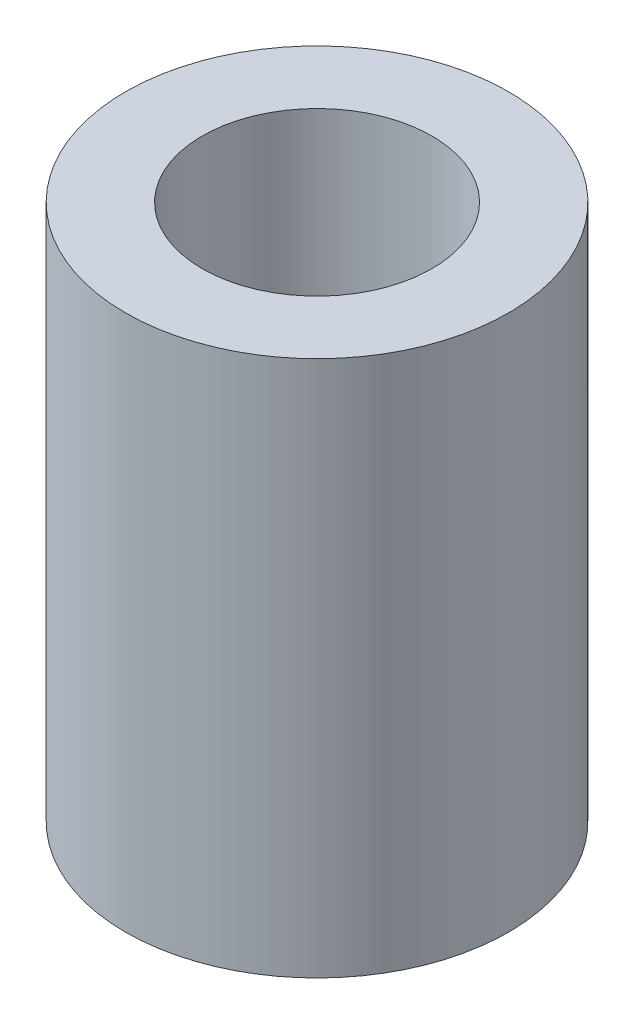
ISO-10303-21;
HEADER;
FILE_DESCRIPTION(('STEP AP214'),'2;1');
FILE_NAME('part.step','',(''),(''),'','','');
FILE_SCHEMA(('AUTOMOTIVE_DESIGN { 1 0 10303 214 1 1 1 1 }'));
ENDSEC;
DATA;
#1=APPLICATION_CONTEXT('core data for automotive mechanical design processes');
#2=APPLICATION_PROTOCOL_DEFINITION('international standard','automotive_design',2000,#1);
#3=PRODUCT_CONTEXT('',#1,'mechanical');
#4=PRODUCT('Part','Part','',(#3));
#5=PRODUCT_RELATED_PRODUCT_CATEGORY('part','',(#4));
#6=PRODUCT_DEFINITION_FORMATION('','',#4);
#7=PRODUCT_DEFINITION_CONTEXT('part definition',#1,'design');
#8=PRODUCT_DEFINITION('design','',#6,#7);
#9=PRODUCT_DEFINITION_SHAPE('','',#8);
#10=(LENGTH_UNIT() NAMED_UNIT(*) SI_UNIT(.MILLI.,.METRE.));
#11=(NAMED_UNIT(*) PLANE_ANGLE_UNIT() SI_UNIT($,.RADIAN.));
#12=(NAMED_UNIT(*) SI_UNIT($,.STERADIAN.) SOLID_ANGLE_UNIT());
#13=UNCERTAINTY_MEASURE_WITH_UNIT(LENGTH_MEASURE(1.E-05),#10,'distance_accuracy_value','');
#14=(GEOMETRIC_REPRESENTATION_CONTEXT(3) GLOBAL_UNCERTAINTY_ASSIGNED_CONTEXT((#13)) GLOBAL_UNIT_ASSIGNED_CONTEXT((#10,
#11,#12)) REPRESENTATION_CONTEXT('',''));
#15=CARTESIAN_POINT('',(0.,0.,0.));
#16=DIRECTION('',(0.,0.,1.));
#17=DIRECTION('',(1.,0.,0.));
#18=AXIS2_PLACEMENT_3D('',#15,#16,#17);
#19=CARTESIAN_POINT('',(0.,7.,0.));
#20=DIRECTION('',(0.,1.,0.));
#21=DIRECTION('',(0.,0.,1.));
#22=AXIS2_PLACEMENT_3D('',#19,#20,#21);
#23=PLANE('',#22);
#24=CARTESIAN_POINT('',(0.,7.,0.));
#25=DIRECTION('',(0.,1.,0.));
#26=DIRECTION('',(0.,0.,1.));
#27=AXIS2_PLACEMENT_3D('',#24,#25,#26);
#28=CIRCLE('',#27,2.5);
#29=CARTESIAN_POINT('',(0.,7.,2.5));
#30=VERTEX_POINT('',#29);
#31=EDGE_CURVE('E10',#30,#30,#28,.T.);
#32=ORIENTED_EDGE('',*,*,#31,.T.);
#33=EDGE_LOOP('',(#32));
#34=FACE_BOUND('',#33,.T.);
#35=CARTESIAN_POINT('',(0.,7.,0.));
#36=DIRECTION('',(0.,1.,0.));
#37=DIRECTION('',(0.,0.,1.));
#38=AXIS2_PLACEMENT_3D('',#35,#36,#37);
#39=CIRCLE('',#38,1.5);
#40=CARTESIAN_POINT('',(0.,7.,1.5));
#41=VERTEX_POINT('',#40);
#42=EDGE_CURVE('E43',#41,#41,#39,.T.);
#43=ORIENTED_EDGE('',*,*,#42,.F.);
#44=EDGE_LOOP('',(#43));
#45=FACE_BOUND('',#44,.T.);
#46=ADVANCED_FACE('F32',(#34,#45),#23,.T.);
#47=CARTESIAN_POINT('',(0.,0.,0.));
#48=DIRECTION('',(0.,1.,0.));
#49=DIRECTION('',(0.,0.,1.));
#50=AXIS2_PLACEMENT_3D('',#47,#48,#49);
#51=PLANE('',#50);
#52=CARTESIAN_POINT('',(0.,0.,0.));
#53=DIRECTION('',(0.,1.,0.));
#54=DIRECTION('',(0.,0.,1.));
#55=AXIS2_PLACEMENT_3D('',#52,#53,#54);
#56=CIRCLE('',#55,2.5);
#57=CARTESIAN_POINT('',(0.,0.,2.5));
#58=VERTEX_POINT('',#57);
#59=EDGE_CURVE('E36',#58,#58,#56,.T.);
#60=ORIENTED_EDGE('',*,*,#59,.F.);
#61=EDGE_LOOP('',(#60));
#62=FACE_BOUND('',#61,.T.);
#63=CARTESIAN_POINT('',(0.,0.,0.));
#64=DIRECTION('',(0.,1.,0.));
#65=DIRECTION('',(0.,0.,1.));
#66=AXIS2_PLACEMENT_3D('',#63,#64,#65);
#67=CIRCLE('',#66,1.5);
#68=CARTESIAN_POINT('',(0.,0.,1.5));
#69=VERTEX_POINT('',#68);
#70=EDGE_CURVE('E45',#69,#69,#67,.T.);
#71=ORIENTED_EDGE('',*,*,#70,.T.);
#72=EDGE_LOOP('',(#71));
#73=FACE_BOUND('',#72,.T.);
#74=ADVANCED_FACE('F55',(#62,#73),#51,.F.);
#75=CARTESIAN_POINT('',(0.,7.,0.));
#76=DIRECTION('',(0.,-1.,0.));
#77=DIRECTION('',(0.,0.,-1.));
#78=AXIS2_PLACEMENT_3D('',#75,#76,#77);
#79=CYLINDRICAL_SURFACE('',#78,2.5);
#80=ORIENTED_EDGE('',*,*,#31,.F.);
#81=EDGE_LOOP('',(#80));
#82=FACE_BOUND('',#81,.T.);
#83=ORIENTED_EDGE('',*,*,#59,.T.);
#84=EDGE_LOOP('',(#83));
#85=FACE_BOUND('',#84,.T.);
#86=ADVANCED_FACE('F34',(#82,#85),#79,.T.);
#87=CARTESIAN_POINT('',(0.,7.,0.));
#88=DIRECTION('',(0.,-1.,0.));
#89=DIRECTION('',(0.,0.,-1.));
#90=AXIS2_PLACEMENT_3D('',#87,#88,#89);
#91=CYLINDRICAL_SURFACE('',#90,1.5);
#92=ORIENTED_EDGE('',*,*,#42,.T.);
#93=EDGE_LOOP('',(#92));
#94=FACE_BOUND('',#93,.T.);
#95=ORIENTED_EDGE('',*,*,#70,.F.);
#96=EDGE_LOOP('',(#95));
#97=FACE_BOUND('',#96,.T.);
#98=ADVANCED_FACE('F51',(#94,#97),#91,.F.);
#99=CLOSED_SHELL('',(#46,#74,#86,#98));
#100=MANIFOLD_SOLID_BREP('B2',#99);
#101=ADVANCED_BREP_SHAPE_REPRESENTATION('',(#18,#100),#14);
#102=SHAPE_DEFINITION_REPRESENTATION(#9,#101);
ENDSEC;
END-ISO-10303-21;
